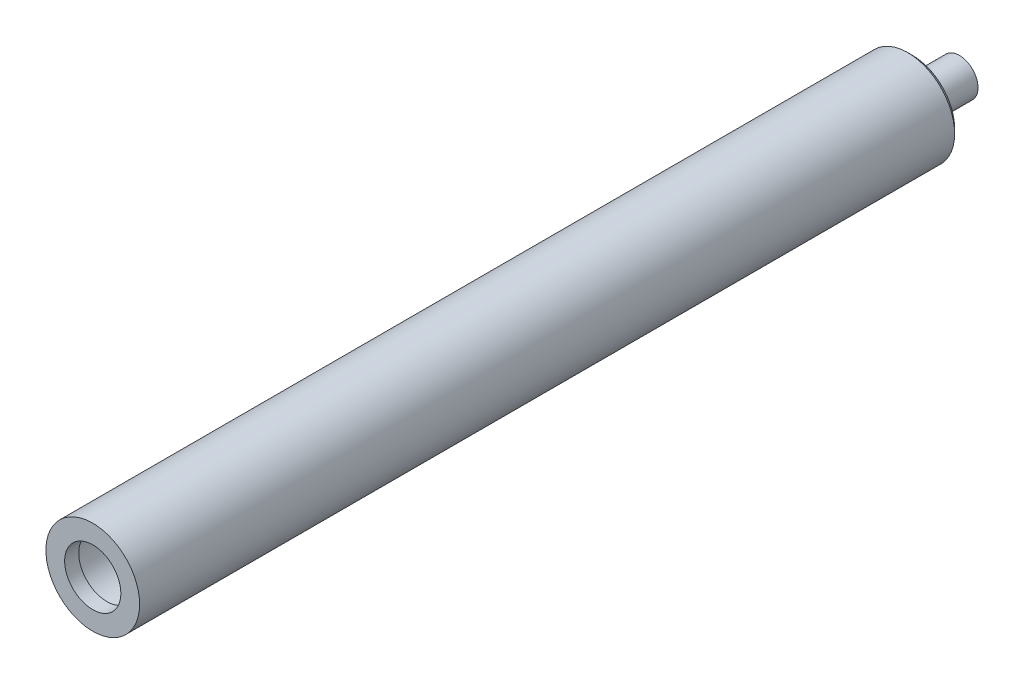
ISO-10303-21;
HEADER;
FILE_DESCRIPTION(('STEP AP214'),'2;1');
FILE_NAME('part.step','',(''),(''),'','','');
FILE_SCHEMA(('AUTOMOTIVE_DESIGN { 1 0 10303 214 1 1 1 1 }'));
ENDSEC;
DATA;
#1=APPLICATION_CONTEXT('core data for automotive mechanical design processes');
#2=APPLICATION_PROTOCOL_DEFINITION('international standard','automotive_design',2000,#1);
#3=PRODUCT_CONTEXT('',#1,'mechanical');
#4=PRODUCT('Part','Part','',(#3));
#5=PRODUCT_RELATED_PRODUCT_CATEGORY('part','',(#4));
#6=PRODUCT_DEFINITION_FORMATION('','',#4);
#7=PRODUCT_DEFINITION_CONTEXT('part definition',#1,'design');
#8=PRODUCT_DEFINITION('design','',#6,#7);
#9=PRODUCT_DEFINITION_SHAPE('','',#8);
#10=(LENGTH_UNIT() NAMED_UNIT(*) SI_UNIT(.MILLI.,.METRE.));
#11=(NAMED_UNIT(*) PLANE_ANGLE_UNIT() SI_UNIT($,.RADIAN.));
#12=(NAMED_UNIT(*) SI_UNIT($,.STERADIAN.) SOLID_ANGLE_UNIT());
#13=UNCERTAINTY_MEASURE_WITH_UNIT(LENGTH_MEASURE(1.E-05),#10,'distance_accuracy_value','');
#14=(GEOMETRIC_REPRESENTATION_CONTEXT(3) GLOBAL_UNCERTAINTY_ASSIGNED_CONTEXT((#13)) GLOBAL_UNIT_ASSIGNED_CONTEXT((#10,
#11,#12)) REPRESENTATION_CONTEXT('',''));
#15=CARTESIAN_POINT('',(0.,0.,0.));
#16=DIRECTION('',(0.,0.,1.));
#17=DIRECTION('',(1.,0.,0.));
#18=AXIS2_PLACEMENT_3D('',#15,#16,#17);
#19=CARTESIAN_POINT('',(0.,0.,175.));
#20=DIRECTION('',(0.,0.,-1.));
#21=DIRECTION('',(-1.,0.,0.));
#22=AXIS2_PLACEMENT_3D('',#19,#20,#21);
#23=CYLINDRICAL_SURFACE('',#22,10.);
#24=CARTESIAN_POINT('',(0.,0.,0.999999999999973));
#25=DIRECTION('',(0.,0.,1.));
#26=DIRECTION('',(1.,0.,0.));
#27=AXIS2_PLACEMENT_3D('',#24,#25,#26);
#28=CIRCLE('',#27,10.);
#29=CARTESIAN_POINT('',(10.,0.,0.999999999999973));
#30=VERTEX_POINT('',#29);
#31=EDGE_CURVE('E53',#30,#30,#28,.T.);
#32=ORIENTED_EDGE('',*,*,#31,.T.);
#33=EDGE_LOOP('',(#32));
#34=FACE_BOUND('',#33,.T.);
#35=CARTESIAN_POINT('',(0.,0.,175.));
#36=DIRECTION('',(0.,0.,1.));
#37=DIRECTION('',(1.,0.,0.));
#38=AXIS2_PLACEMENT_3D('',#35,#36,#37);
#39=CIRCLE('',#38,10.);
#40=CARTESIAN_POINT('',(10.,0.,175.));
#41=VERTEX_POINT('',#40);
#42=EDGE_CURVE('E61',#41,#41,#39,.T.);
#43=ORIENTED_EDGE('',*,*,#42,.F.);
#44=EDGE_LOOP('',(#43));
#45=FACE_BOUND('',#44,.T.);
#46=ADVANCED_FACE('F39',(#34,#45),#23,.T.);
#47=CARTESIAN_POINT('',(0.,0.,175.));
#48=DIRECTION('',(0.,0.,1.));
#49=DIRECTION('',(1.,0.,0.));
#50=AXIS2_PLACEMENT_3D('',#47,#48,#49);
#51=PLANE('',#50);
#52=ORIENTED_EDGE('',*,*,#42,.T.);
#53=EDGE_LOOP('',(#52));
#54=FACE_BOUND('',#53,.T.);
#55=CARTESIAN_POINT('',(0.,0.,175.));
#56=DIRECTION('',(0.,0.,1.));
#57=DIRECTION('',(1.,0.,0.));
#58=AXIS2_PLACEMENT_3D('',#55,#56,#57);
#59=CIRCLE('',#58,6.);
#60=CARTESIAN_POINT('',(6.,0.,175.));
#61=VERTEX_POINT('',#60);
#62=EDGE_CURVE('E77',#61,#61,#59,.T.);
#63=ORIENTED_EDGE('',*,*,#62,.F.);
#64=EDGE_LOOP('',(#63));
#65=FACE_BOUND('',#64,.T.);
#66=ADVANCED_FACE('F94',(#54,#65),#51,.T.);
#67=CARTESIAN_POINT('',(0.,0.,0.));
#68=DIRECTION('',(0.,0.,1.));
#69=DIRECTION('',(1.,0.,0.));
#70=AXIS2_PLACEMENT_3D('',#67,#68,#69);
#71=PLANE('',#70);
#72=CARTESIAN_POINT('',(0.,0.,0.));
#73=DIRECTION('',(0.,0.,1.));
#74=DIRECTION('',(1.,0.,0.));
#75=AXIS2_PLACEMENT_3D('',#72,#73,#74);
#76=CIRCLE('',#75,9.00000000000004);
#77=CARTESIAN_POINT('',(9.00000000000004,0.,0.));
#78=VERTEX_POINT('',#77);
#79=EDGE_CURVE('E48',#78,#78,#76,.F.);
#80=ORIENTED_EDGE('',*,*,#79,.T.);
#81=EDGE_LOOP('',(#80));
#82=FACE_BOUND('',#81,.T.);
#83=CARTESIAN_POINT('',(0.,0.,0.));
#84=DIRECTION('',(0.,0.,-1.));
#85=DIRECTION('',(-1.,0.,0.));
#86=AXIS2_PLACEMENT_3D('',#83,#84,#85);
#87=CIRCLE('',#86,4.);
#88=CARTESIAN_POINT('',(-4.,0.,0.));
#89=VERTEX_POINT('',#88);
#90=EDGE_CURVE('E58',#89,#89,#87,.T.);
#91=ORIENTED_EDGE('',*,*,#90,.F.);
#92=EDGE_LOOP('',(#91));
#93=FACE_BOUND('',#92,.T.);
#94=ADVANCED_FACE('F96',(#82,#93),#71,.F.);
#95=CARTESIAN_POINT('',(0.,0.,-10.));
#96=DIRECTION('',(0.,0.,1.));
#97=DIRECTION('',(1.,0.,0.));
#98=AXIS2_PLACEMENT_3D('',#95,#96,#97);
#99=CYLINDRICAL_SURFACE('',#98,4.);
#100=CARTESIAN_POINT('',(0.,0.,-10.));
#101=DIRECTION('',(0.,0.,-1.));
#102=DIRECTION('',(-1.,0.,0.));
#103=AXIS2_PLACEMENT_3D('',#100,#101,#102);
#104=CIRCLE('',#103,4.);
#105=CARTESIAN_POINT('',(-4.,0.,-10.));
#106=VERTEX_POINT('',#105);
#107=EDGE_CURVE('E69',#106,#106,#104,.T.);
#108=ORIENTED_EDGE('',*,*,#107,.F.);
#109=EDGE_LOOP('',(#108));
#110=FACE_BOUND('',#109,.T.);
#111=ORIENTED_EDGE('',*,*,#90,.T.);
#112=EDGE_LOOP('',(#111));
#113=FACE_BOUND('',#112,.T.);
#114=ADVANCED_FACE('F104',(#110,#113),#99,.T.);
#115=CARTESIAN_POINT('',(0.,0.,-10.));
#116=DIRECTION('',(0.,0.,-1.));
#117=DIRECTION('',(-1.,0.,0.));
#118=AXIS2_PLACEMENT_3D('',#115,#116,#117);
#119=PLANE('',#118);
#120=ORIENTED_EDGE('',*,*,#107,.T.);
#121=EDGE_LOOP('',(#120));
#122=FACE_BOUND('',#121,.T.);
#123=ADVANCED_FACE('F118',(#122),#119,.T.);
#124=CARTESIAN_POINT('',(0.,0.,0.999999999999973));
#125=DIRECTION('',(0.,0.,1.));
#126=DIRECTION('',(1.,0.,0.));
#127=AXIS2_PLACEMENT_3D('',#124,#125,#126);
#128=CONICAL_SURFACE('',#127,10.,0.785398163397444);
#129=ORIENTED_EDGE('',*,*,#79,.F.);
#130=EDGE_LOOP('',(#129));
#131=FACE_BOUND('',#130,.T.);
#132=ORIENTED_EDGE('',*,*,#31,.F.);
#133=EDGE_LOOP('',(#132));
#134=FACE_BOUND('',#133,.T.);
#135=ADVANCED_FACE('F42',(#131,#134),#128,.T.);
#136=CARTESIAN_POINT('',(0.,0.,172.));
#137=DIRECTION('',(0.,0.,1.));
#138=DIRECTION('',(1.,0.,0.));
#139=AXIS2_PLACEMENT_3D('',#136,#137,#138);
#140=PLANE('',#139);
#141=CARTESIAN_POINT('',(0.,0.,172.));
#142=DIRECTION('',(0.,0.,1.));
#143=DIRECTION('',(1.,0.,0.));
#144=AXIS2_PLACEMENT_3D('',#141,#142,#143);
#145=CIRCLE('',#144,6.);
#146=CARTESIAN_POINT('',(6.,0.,172.));
#147=VERTEX_POINT('',#146);
#148=EDGE_CURVE('E76',#147,#147,#145,.T.);
#149=ORIENTED_EDGE('',*,*,#148,.T.);
#150=EDGE_LOOP('',(#149));
#151=FACE_BOUND('',#150,.T.);
#152=CARTESIAN_POINT('',(0.,0.,172.));
#153=DIRECTION('',(0.,0.,1.));
#154=DIRECTION('',(1.,0.,0.));
#155=AXIS2_PLACEMENT_3D('',#152,#153,#154);
#156=CIRCLE('',#155,7.);
#157=CARTESIAN_POINT('',(7.,0.,172.));
#158=VERTEX_POINT('',#157);
#159=EDGE_CURVE('E10',#158,#158,#156,.F.);
#160=ORIENTED_EDGE('',*,*,#159,.T.);
#161=EDGE_LOOP('',(#160));
#162=FACE_BOUND('',#161,.T.);
#163=ADVANCED_FACE('F85',(#151,#162),#140,.F.);
#164=CARTESIAN_POINT('',(0.,0.,172.));
#165=DIRECTION('',(0.,0.,1.));
#166=DIRECTION('',(1.,0.,0.));
#167=AXIS2_PLACEMENT_3D('',#164,#165,#166);
#168=CYLINDRICAL_SURFACE('',#167,6.);
#169=ORIENTED_EDGE('',*,*,#148,.F.);
#170=EDGE_LOOP('',(#169));
#171=FACE_BOUND('',#170,.T.);
#172=ORIENTED_EDGE('',*,*,#62,.T.);
#173=EDGE_LOOP('',(#172));
#174=FACE_BOUND('',#173,.T.);
#175=ADVANCED_FACE('F87',(#171,#174),#168,.F.);
#176=CARTESIAN_POINT('',(0.,0.,7.99999999999998));
#177=DIRECTION('',(0.,0.,1.));
#178=DIRECTION('',(1.,0.,0.));
#179=AXIS2_PLACEMENT_3D('',#176,#177,#178);
#180=PLANE('',#179);
#181=CARTESIAN_POINT('',(0.,0.,7.99999999999998));
#182=DIRECTION('',(0.,0.,1.));
#183=DIRECTION('',(1.,0.,0.));
#184=AXIS2_PLACEMENT_3D('',#181,#182,#183);
#185=CIRCLE('',#184,7.);
#186=CARTESIAN_POINT('',(7.,0.,7.99999999999998));
#187=VERTEX_POINT('',#186);
#188=EDGE_CURVE('E65',#187,#187,#185,.T.);
#189=ORIENTED_EDGE('',*,*,#188,.T.);
#190=EDGE_LOOP('',(#189));
#191=FACE_BOUND('',#190,.T.);
#192=ADVANCED_FACE('F90',(#191),#180,.T.);
#193=CARTESIAN_POINT('',(0.,0.,7.99999999999998));
#194=DIRECTION('',(0.,0.,1.));
#195=DIRECTION('',(1.,0.,0.));
#196=AXIS2_PLACEMENT_3D('',#193,#194,#195);
#197=CYLINDRICAL_SURFACE('',#196,7.);
#198=CARTESIAN_POINT('',(7.,0.,7.99999999999998));
#199=CARTESIAN_POINT('',(7.,0.,9.70833333333331));
#200=CARTESIAN_POINT('',(7.,0.,11.4166666666666));
#201=CARTESIAN_POINT('',(7.,0.,14.8333333333333));
#202=CARTESIAN_POINT('',(7.,0.,16.5416666666667));
#203=CARTESIAN_POINT('',(7.,0.,19.9583333333333));
#204=CARTESIAN_POINT('',(7.,0.,21.6666666666666));
#205=CARTESIAN_POINT('',(7.,0.,25.0833333333333));
#206=CARTESIAN_POINT('',(7.,0.,26.7916666666666));
#207=CARTESIAN_POINT('',(7.,0.,30.2083333333333));
#208=CARTESIAN_POINT('',(7.,0.,31.9166666666667));
#209=CARTESIAN_POINT('',(7.,0.,35.3333333333333));
#210=CARTESIAN_POINT('',(7.,0.,37.0416666666666));
#211=CARTESIAN_POINT('',(7.,0.,40.4583333333333));
#212=CARTESIAN_POINT('',(7.,0.,42.1666666666666));
#213=CARTESIAN_POINT('',(7.,0.,45.5833333333333));
#214=CARTESIAN_POINT('',(7.,0.,47.2916666666667));
#215=CARTESIAN_POINT('',(7.,0.,50.7083333333333));
#216=CARTESIAN_POINT('',(7.,0.,52.4166666666667));
#217=CARTESIAN_POINT('',(7.,0.,55.8333333333333));
#218=CARTESIAN_POINT('',(7.,0.,57.5416666666667));
#219=CARTESIAN_POINT('',(7.,0.,60.9583333333333));
#220=CARTESIAN_POINT('',(7.,0.,62.6666666666667));
#221=CARTESIAN_POINT('',(7.,0.,66.0833333333333));
#222=CARTESIAN_POINT('',(7.,0.,67.7916666666667));
#223=CARTESIAN_POINT('',(7.,0.,71.2083333333333));
#224=CARTESIAN_POINT('',(7.,0.,72.9166666666666));
#225=CARTESIAN_POINT('',(7.,0.,76.3333333333333));
#226=CARTESIAN_POINT('',(7.,0.,78.0416666666666));
#227=CARTESIAN_POINT('',(7.,0.,81.4583333333333));
#228=CARTESIAN_POINT('',(7.,0.,83.1666666666666));
#229=CARTESIAN_POINT('',(7.,0.,86.5833333333333));
#230=CARTESIAN_POINT('',(7.,0.,88.2916666666666));
#231=CARTESIAN_POINT('',(7.,0.,91.7083333333333));
#232=CARTESIAN_POINT('',(7.,0.,93.4166666666666));
#233=CARTESIAN_POINT('',(7.,0.,96.8333333333333));
#234=CARTESIAN_POINT('',(7.,0.,98.5416666666667));
#235=CARTESIAN_POINT('',(7.,0.,101.958333333333));
#236=CARTESIAN_POINT('',(7.,0.,103.666666666667));
#237=CARTESIAN_POINT('',(7.,0.,107.083333333333));
#238=CARTESIAN_POINT('',(7.,0.,108.791666666667));
#239=CARTESIAN_POINT('',(7.,0.,112.208333333333));
#240=CARTESIAN_POINT('',(7.,0.,113.916666666667));
#241=CARTESIAN_POINT('',(7.,0.,117.333333333333));
#242=CARTESIAN_POINT('',(7.,0.,119.041666666667));
#243=CARTESIAN_POINT('',(7.,0.,122.458333333333));
#244=CARTESIAN_POINT('',(7.,0.,124.166666666667));
#245=CARTESIAN_POINT('',(7.,0.,127.583333333333));
#246=CARTESIAN_POINT('',(7.,0.,129.291666666667));
#247=CARTESIAN_POINT('',(7.,0.,132.708333333333));
#248=CARTESIAN_POINT('',(7.,0.,134.416666666667));
#249=CARTESIAN_POINT('',(7.,0.,137.833333333333));
#250=CARTESIAN_POINT('',(7.,0.,139.541666666667));
#251=CARTESIAN_POINT('',(7.,0.,142.958333333333));
#252=CARTESIAN_POINT('',(7.,0.,144.666666666667));
#253=CARTESIAN_POINT('',(7.,0.,148.083333333333));
#254=CARTESIAN_POINT('',(7.,0.,149.791666666667));
#255=CARTESIAN_POINT('',(7.,0.,153.208333333333));
#256=CARTESIAN_POINT('',(7.,0.,154.916666666667));
#257=CARTESIAN_POINT('',(7.,0.,158.333333333333));
#258=CARTESIAN_POINT('',(7.,0.,160.041666666667));
#259=CARTESIAN_POINT('',(7.,0.,163.458333333333));
#260=CARTESIAN_POINT('',(7.,0.,165.166666666667));
#261=CARTESIAN_POINT('',(7.,0.,168.583333333333));
#262=CARTESIAN_POINT('',(7.,0.,170.291666666667));
#263=CARTESIAN_POINT('',(7.,0.,172.));
#264=B_SPLINE_CURVE_WITH_KNOTS('',3,(#198,#199,#200,#201,#202,#203,#204,#205,#206,#207,#208,
#209,#210,#211,#212,#213,#214,#215,#216,#217,#218,#219,#220,#221,#222,#223,#224,#225,#226,#227,
#228,#229,#230,#231,#232,#233,#234,#235,#236,#237,#238,#239,#240,#241,#242,#243,#244,#245,#246,
#247,#248,#249,#250,#251,#252,#253,#254,#255,#256,#257,#258,#259,#260,#261,#262,#263),
.UNSPECIFIED.,.F.,.F.,(4,2,2,2,2,2,2,2,2,2,2,2,2,2,2,2,2,2,2,2,2,2,2,2,2,2,2,2,2,2,2,2,4),(0.,
5.125,10.25,15.375,20.5,25.625,30.75,35.875,41.,46.125,51.25,56.375,61.5,66.625,71.75,76.875,
82.,87.125,92.25,97.375,102.5,107.625,112.75,117.875,123.,128.125,133.25,138.375,143.5,148.625,
153.75,158.875,164.),.UNSPECIFIED.);
#265=EDGE_CURVE('BSEAM109',#187,#158,#264,.T.);
#266=ORIENTED_EDGE('',*,*,#188,.F.);
#267=ORIENTED_EDGE('',*,*,#159,.F.);
#268=ORIENTED_EDGE('',*,*,#265,.T.);
#269=ORIENTED_EDGE('',*,*,#265,.F.);
#270=EDGE_LOOP('',(#266,#268,#267,#269));
#271=FACE_BOUND('',#270,.T.);
#272=ADVANCED_FACE('F109',(#271),#197,.F.);
#273=CLOSED_SHELL('',(#46,#66,#94,#114,#123,#135,#163,#175,#192,#272));
#274=MANIFOLD_SOLID_BREP('B2',#273);
#275=ADVANCED_BREP_SHAPE_REPRESENTATION('',(#18,#274),#14);
#276=SHAPE_DEFINITION_REPRESENTATION(#9,#275);
ENDSEC;
END-ISO-10303-21;
